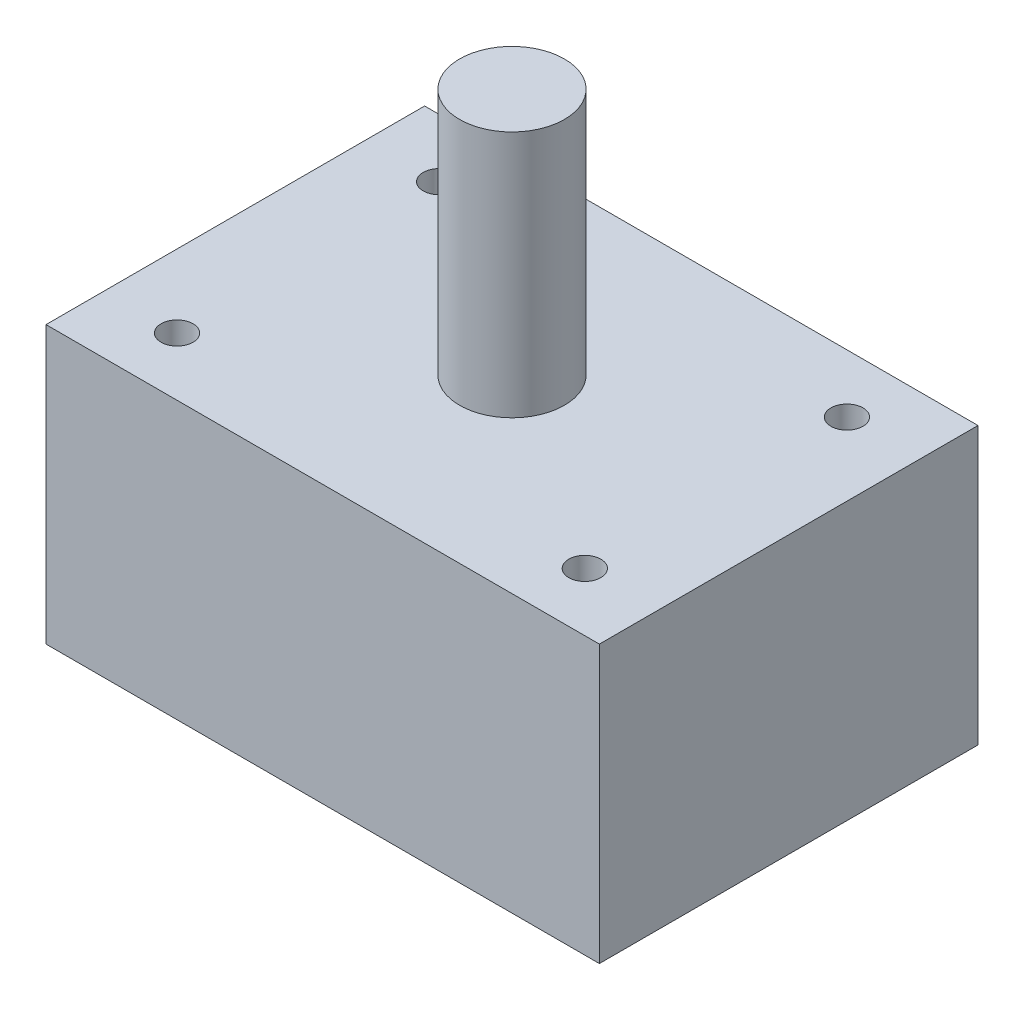
ISO-10303-21;
HEADER;
FILE_DESCRIPTION(('STEP AP214'),'2;1');
FILE_NAME('part.step','',(''),(''),'','','');
FILE_SCHEMA(('AUTOMOTIVE_DESIGN { 1 0 10303 214 1 1 1 1 }'));
ENDSEC;
DATA;
#1=APPLICATION_CONTEXT('core data for automotive mechanical design processes');
#2=APPLICATION_PROTOCOL_DEFINITION('international standard','automotive_design',2000,#1);
#3=PRODUCT_CONTEXT('',#1,'mechanical');
#4=PRODUCT('Part','Part','',(#3));
#5=PRODUCT_RELATED_PRODUCT_CATEGORY('part','',(#4));
#6=PRODUCT_DEFINITION_FORMATION('','',#4);
#7=PRODUCT_DEFINITION_CONTEXT('part definition',#1,'design');
#8=PRODUCT_DEFINITION('design','',#6,#7);
#9=PRODUCT_DEFINITION_SHAPE('','',#8);
#10=(LENGTH_UNIT() NAMED_UNIT(*) SI_UNIT(.MILLI.,.METRE.));
#11=(NAMED_UNIT(*) PLANE_ANGLE_UNIT() SI_UNIT($,.RADIAN.));
#12=(NAMED_UNIT(*) SI_UNIT($,.STERADIAN.) SOLID_ANGLE_UNIT());
#13=UNCERTAINTY_MEASURE_WITH_UNIT(LENGTH_MEASURE(1.E-05),#10,'distance_accuracy_value','');
#14=(GEOMETRIC_REPRESENTATION_CONTEXT(3) GLOBAL_UNCERTAINTY_ASSIGNED_CONTEXT((#13)) GLOBAL_UNIT_ASSIGNED_CONTEXT((#10,
#11,#12)) REPRESENTATION_CONTEXT('',''));
#15=CARTESIAN_POINT('',(0.,0.,0.));
#16=DIRECTION('',(0.,0.,1.));
#17=DIRECTION('',(1.,0.,0.));
#18=AXIS2_PLACEMENT_3D('',#15,#16,#17);
#19=CARTESIAN_POINT('',(0.,95.,0.));
#20=DIRECTION('',(0.,-1.,0.));
#21=DIRECTION('',(0.,0.,-1.));
#22=AXIS2_PLACEMENT_3D('',#19,#20,#21);
#23=PLANE('',#22);
#24=CARTESIAN_POINT('',(0.,95.,0.));
#25=DIRECTION('',(0.,-1.,0.));
#26=DIRECTION('',(0.,0.,-1.));
#27=AXIS2_PLACEMENT_3D('',#24,#25,#26);
#28=CIRCLE('',#27,18.);
#29=CARTESIAN_POINT('',(0.,95.,-18.));
#30=VERTEX_POINT('',#29);
#31=EDGE_CURVE('E11',#30,#30,#28,.F.);
#32=ORIENTED_EDGE('',*,*,#31,.F.);
#33=EDGE_LOOP('',(#32));
#34=FACE_BOUND('',#33,.T.);
#35=DIRECTION('',(0.,0.,-1.));
#36=VECTOR('',#35,1.);
#37=CARTESIAN_POINT('',(95.,95.,65.));
#38=LINE('',#37,#36);
#39=CARTESIAN_POINT('',(95.,95.,65.));
#40=VERTEX_POINT('',#39);
#41=CARTESIAN_POINT('',(95.,95.,-65.));
#42=VERTEX_POINT('',#41);
#43=EDGE_CURVE('E93',#40,#42,#38,.T.);
#44=ORIENTED_EDGE('',*,*,#43,.T.);
#45=DIRECTION('',(-1.,0.,0.));
#46=VECTOR('',#45,1.);
#47=CARTESIAN_POINT('',(-95.,95.,-65.));
#48=LINE('',#47,#46);
#49=CARTESIAN_POINT('',(-95.,95.,-65.));
#50=VERTEX_POINT('',#49);
#51=EDGE_CURVE('E88',#42,#50,#48,.T.);
#52=ORIENTED_EDGE('',*,*,#51,.T.);
#53=DIRECTION('',(0.,0.,1.));
#54=VECTOR('',#53,1.);
#55=CARTESIAN_POINT('',(-95.,95.,65.));
#56=LINE('',#55,#54);
#57=CARTESIAN_POINT('',(-95.,95.,65.));
#58=VERTEX_POINT('',#57);
#59=EDGE_CURVE('E91',#50,#58,#56,.T.);
#60=ORIENTED_EDGE('',*,*,#59,.T.);
#61=DIRECTION('',(1.,0.,0.));
#62=VECTOR('',#61,1.);
#63=CARTESIAN_POINT('',(-95.,95.,65.));
#64=LINE('',#63,#62);
#65=EDGE_CURVE('E57',#58,#40,#64,.T.);
#66=ORIENTED_EDGE('',*,*,#65,.T.);
#67=EDGE_LOOP('',(#44,#52,#60,#66));
#68=FACE_BOUND('',#67,.T.);
#69=CARTESIAN_POINT('',(-70.,95.,45.));
#70=DIRECTION('',(0.,1.,0.));
#71=DIRECTION('',(0.,0.,1.));
#72=AXIS2_PLACEMENT_3D('',#69,#70,#71);
#73=CIRCLE('',#72,5.5);
#74=CARTESIAN_POINT('',(-70.,95.,50.5));
#75=VERTEX_POINT('',#74);
#76=EDGE_CURVE('E109',#75,#75,#73,.T.);
#77=ORIENTED_EDGE('',*,*,#76,.F.);
#78=EDGE_LOOP('',(#77));
#79=FACE_BOUND('',#78,.T.);
#80=CARTESIAN_POINT('',(70.,95.,45.));
#81=DIRECTION('',(0.,1.,0.));
#82=DIRECTION('',(0.,0.,1.));
#83=AXIS2_PLACEMENT_3D('',#80,#81,#82);
#84=CIRCLE('',#83,5.5);
#85=CARTESIAN_POINT('',(70.,95.,50.5));
#86=VERTEX_POINT('',#85);
#87=EDGE_CURVE('E124',#86,#86,#84,.T.);
#88=ORIENTED_EDGE('',*,*,#87,.F.);
#89=EDGE_LOOP('',(#88));
#90=FACE_BOUND('',#89,.T.);
#91=CARTESIAN_POINT('',(-70.,95.,-45.));
#92=DIRECTION('',(0.,1.,0.));
#93=DIRECTION('',(0.,0.,1.));
#94=AXIS2_PLACEMENT_3D('',#91,#92,#93);
#95=CIRCLE('',#94,5.5);
#96=CARTESIAN_POINT('',(-70.,95.,-39.5));
#97=VERTEX_POINT('',#96);
#98=EDGE_CURVE('E130',#97,#97,#95,.T.);
#99=ORIENTED_EDGE('',*,*,#98,.F.);
#100=EDGE_LOOP('',(#99));
#101=FACE_BOUND('',#100,.T.);
#102=CARTESIAN_POINT('',(70.,95.,-45.));
#103=DIRECTION('',(0.,1.,0.));
#104=DIRECTION('',(0.,0.,1.));
#105=AXIS2_PLACEMENT_3D('',#102,#103,#104);
#106=CIRCLE('',#105,5.5);
#107=CARTESIAN_POINT('',(70.,95.,-39.5));
#108=VERTEX_POINT('',#107);
#109=EDGE_CURVE('E136',#108,#108,#106,.T.);
#110=ORIENTED_EDGE('',*,*,#109,.F.);
#111=EDGE_LOOP('',(#110));
#112=FACE_BOUND('',#111,.T.);
#113=ADVANCED_FACE('F39',(#34,#68,#79,#90,#101,#112),#23,.F.);
#114=CARTESIAN_POINT('',(0.,0.,0.));
#115=DIRECTION('',(0.,-1.,0.));
#116=DIRECTION('',(0.,0.,-1.));
#117=AXIS2_PLACEMENT_3D('',#114,#115,#116);
#118=PLANE('',#117);
#119=CARTESIAN_POINT('',(-70.,0.,-45.));
#120=DIRECTION('',(0.,1.,0.));
#121=DIRECTION('',(0.,0.,1.));
#122=AXIS2_PLACEMENT_3D('',#119,#120,#121);
#123=CIRCLE('',#122,5.5);
#124=CARTESIAN_POINT('',(-70.,0.,-39.5));
#125=VERTEX_POINT('',#124);
#126=EDGE_CURVE('E133',#125,#125,#123,.T.);
#127=ORIENTED_EDGE('',*,*,#126,.T.);
#128=EDGE_LOOP('',(#127));
#129=FACE_BOUND('',#128,.T.);
#130=CARTESIAN_POINT('',(-70.,0.,45.));
#131=DIRECTION('',(0.,1.,0.));
#132=DIRECTION('',(0.,0.,1.));
#133=AXIS2_PLACEMENT_3D('',#130,#131,#132);
#134=CIRCLE('',#133,5.5);
#135=CARTESIAN_POINT('',(-70.,0.,50.5));
#136=VERTEX_POINT('',#135);
#137=EDGE_CURVE('E121',#136,#136,#134,.T.);
#138=ORIENTED_EDGE('',*,*,#137,.T.);
#139=EDGE_LOOP('',(#138));
#140=FACE_BOUND('',#139,.T.);
#141=DIRECTION('',(0.,0.,-1.));
#142=VECTOR('',#141,1.);
#143=CARTESIAN_POINT('',(95.,0.,65.));
#144=LINE('',#143,#142);
#145=CARTESIAN_POINT('',(95.,0.,65.));
#146=VERTEX_POINT('',#145);
#147=CARTESIAN_POINT('',(95.,0.,-65.));
#148=VERTEX_POINT('',#147);
#149=EDGE_CURVE('E106',#146,#148,#144,.T.);
#150=ORIENTED_EDGE('',*,*,#149,.F.);
#151=DIRECTION('',(1.,0.,0.));
#152=VECTOR('',#151,1.);
#153=CARTESIAN_POINT('',(-95.,0.,65.));
#154=LINE('',#153,#152);
#155=CARTESIAN_POINT('',(-95.,0.,65.));
#156=VERTEX_POINT('',#155);
#157=EDGE_CURVE('E80',#156,#146,#154,.T.);
#158=ORIENTED_EDGE('',*,*,#157,.F.);
#159=DIRECTION('',(0.,0.,1.));
#160=VECTOR('',#159,1.);
#161=CARTESIAN_POINT('',(-95.,0.,65.));
#162=LINE('',#161,#160);
#163=CARTESIAN_POINT('',(-95.,0.,-65.));
#164=VERTEX_POINT('',#163);
#165=EDGE_CURVE('E74',#164,#156,#162,.T.);
#166=ORIENTED_EDGE('',*,*,#165,.F.);
#167=DIRECTION('',(-1.,0.,0.));
#168=VECTOR('',#167,1.);
#169=CARTESIAN_POINT('',(-95.,0.,-65.));
#170=LINE('',#169,#168);
#171=EDGE_CURVE('E98',#148,#164,#170,.T.);
#172=ORIENTED_EDGE('',*,*,#171,.F.);
#173=EDGE_LOOP('',(#150,#158,#166,#172));
#174=FACE_BOUND('',#173,.T.);
#175=CARTESIAN_POINT('',(70.,0.,45.));
#176=DIRECTION('',(0.,1.,0.));
#177=DIRECTION('',(0.,0.,1.));
#178=AXIS2_PLACEMENT_3D('',#175,#176,#177);
#179=CIRCLE('',#178,5.5);
#180=CARTESIAN_POINT('',(70.,0.,50.5));
#181=VERTEX_POINT('',#180);
#182=EDGE_CURVE('E127',#181,#181,#179,.T.);
#183=ORIENTED_EDGE('',*,*,#182,.T.);
#184=EDGE_LOOP('',(#183));
#185=FACE_BOUND('',#184,.T.);
#186=CARTESIAN_POINT('',(70.,0.,-45.));
#187=DIRECTION('',(0.,1.,0.));
#188=DIRECTION('',(0.,0.,1.));
#189=AXIS2_PLACEMENT_3D('',#186,#187,#188);
#190=CIRCLE('',#189,5.5);
#191=CARTESIAN_POINT('',(70.,0.,-39.5));
#192=VERTEX_POINT('',#191);
#193=EDGE_CURVE('E139',#192,#192,#190,.T.);
#194=ORIENTED_EDGE('',*,*,#193,.T.);
#195=EDGE_LOOP('',(#194));
#196=FACE_BOUND('',#195,.T.);
#197=ADVANCED_FACE('F117',(#129,#140,#174,#185,#196),#118,.T.);
#198=CARTESIAN_POINT('',(95.,95.,65.));
#199=DIRECTION('',(-1.,0.,0.));
#200=DIRECTION('',(0.,0.,1.));
#201=AXIS2_PLACEMENT_3D('',#198,#199,#200);
#202=PLANE('',#201);
#203=ORIENTED_EDGE('',*,*,#149,.T.);
#204=DIRECTION('',(0.,-1.,0.));
#205=VECTOR('',#204,1.);
#206=CARTESIAN_POINT('',(95.,95.,-65.));
#207=LINE('',#206,#205);
#208=EDGE_CURVE('E43',#42,#148,#207,.T.);
#209=ORIENTED_EDGE('',*,*,#208,.F.);
#210=ORIENTED_EDGE('',*,*,#43,.F.);
#211=DIRECTION('',(0.,-1.,0.));
#212=VECTOR('',#211,1.);
#213=CARTESIAN_POINT('',(95.,95.,65.));
#214=LINE('',#213,#212);
#215=EDGE_CURVE('E102',#40,#146,#214,.T.);
#216=ORIENTED_EDGE('',*,*,#215,.T.);
#217=EDGE_LOOP('',(#203,#209,#210,#216));
#218=FACE_BOUND('',#217,.T.);
#219=ADVANCED_FACE('F41',(#218),#202,.F.);
#220=CARTESIAN_POINT('',(-95.,95.,-65.));
#221=DIRECTION('',(0.,0.,1.));
#222=DIRECTION('',(1.,0.,0.));
#223=AXIS2_PLACEMENT_3D('',#220,#221,#222);
#224=PLANE('',#223);
#225=ORIENTED_EDGE('',*,*,#171,.T.);
#226=DIRECTION('',(0.,-1.,0.));
#227=VECTOR('',#226,1.);
#228=CARTESIAN_POINT('',(-95.,95.,-65.));
#229=LINE('',#228,#227);
#230=EDGE_CURVE('E96',#50,#164,#229,.T.);
#231=ORIENTED_EDGE('',*,*,#230,.F.);
#232=ORIENTED_EDGE('',*,*,#51,.F.);
#233=ORIENTED_EDGE('',*,*,#208,.T.);
#234=EDGE_LOOP('',(#225,#231,#232,#233));
#235=FACE_BOUND('',#234,.T.);
#236=ADVANCED_FACE('F97',(#235),#224,.F.);
#237=CARTESIAN_POINT('',(-95.,95.,65.));
#238=DIRECTION('',(1.,0.,0.));
#239=DIRECTION('',(0.,0.,-1.));
#240=AXIS2_PLACEMENT_3D('',#237,#238,#239);
#241=PLANE('',#240);
#242=ORIENTED_EDGE('',*,*,#165,.T.);
#243=DIRECTION('',(0.,-1.,0.));
#244=VECTOR('',#243,1.);
#245=CARTESIAN_POINT('',(-95.,95.,65.));
#246=LINE('',#245,#244);
#247=EDGE_CURVE('E99',#58,#156,#246,.T.);
#248=ORIENTED_EDGE('',*,*,#247,.F.);
#249=ORIENTED_EDGE('',*,*,#59,.F.);
#250=ORIENTED_EDGE('',*,*,#230,.T.);
#251=EDGE_LOOP('',(#242,#248,#249,#250));
#252=FACE_BOUND('',#251,.T.);
#253=ADVANCED_FACE('F100',(#252),#241,.F.);
#254=CARTESIAN_POINT('',(-95.,95.,65.));
#255=DIRECTION('',(0.,0.,-1.));
#256=DIRECTION('',(-1.,0.,0.));
#257=AXIS2_PLACEMENT_3D('',#254,#255,#256);
#258=PLANE('',#257);
#259=ORIENTED_EDGE('',*,*,#157,.T.);
#260=ORIENTED_EDGE('',*,*,#215,.F.);
#261=ORIENTED_EDGE('',*,*,#65,.F.);
#262=ORIENTED_EDGE('',*,*,#247,.T.);
#263=EDGE_LOOP('',(#259,#260,#261,#262));
#264=FACE_BOUND('',#263,.T.);
#265=ADVANCED_FACE('F114',(#264),#258,.F.);
#266=CARTESIAN_POINT('',(-70.,95.,45.));
#267=DIRECTION('',(0.,-1.,0.));
#268=DIRECTION('',(0.,0.,-1.));
#269=AXIS2_PLACEMENT_3D('',#266,#267,#268);
#270=CYLINDRICAL_SURFACE('',#269,5.5);
#271=ORIENTED_EDGE('',*,*,#76,.T.);
#272=EDGE_LOOP('',(#271));
#273=FACE_BOUND('',#272,.T.);
#274=ORIENTED_EDGE('',*,*,#137,.F.);
#275=EDGE_LOOP('',(#274));
#276=FACE_BOUND('',#275,.T.);
#277=ADVANCED_FACE('F165',(#273,#276),#270,.F.);
#278=CARTESIAN_POINT('',(70.,95.,45.));
#279=DIRECTION('',(0.,-1.,0.));
#280=DIRECTION('',(0.,0.,-1.));
#281=AXIS2_PLACEMENT_3D('',#278,#279,#280);
#282=CYLINDRICAL_SURFACE('',#281,5.5);
#283=ORIENTED_EDGE('',*,*,#87,.T.);
#284=EDGE_LOOP('',(#283));
#285=FACE_BOUND('',#284,.T.);
#286=ORIENTED_EDGE('',*,*,#182,.F.);
#287=EDGE_LOOP('',(#286));
#288=FACE_BOUND('',#287,.T.);
#289=ADVANCED_FACE('F221',(#285,#288),#282,.F.);
#290=CARTESIAN_POINT('',(-70.,95.,-45.));
#291=DIRECTION('',(0.,-1.,0.));
#292=DIRECTION('',(0.,0.,-1.));
#293=AXIS2_PLACEMENT_3D('',#290,#291,#292);
#294=CYLINDRICAL_SURFACE('',#293,5.5);
#295=ORIENTED_EDGE('',*,*,#98,.T.);
#296=EDGE_LOOP('',(#295));
#297=FACE_BOUND('',#296,.T.);
#298=ORIENTED_EDGE('',*,*,#126,.F.);
#299=EDGE_LOOP('',(#298));
#300=FACE_BOUND('',#299,.T.);
#301=ADVANCED_FACE('F212',(#297,#300),#294,.F.);
#302=CARTESIAN_POINT('',(70.,95.,-45.));
#303=DIRECTION('',(0.,-1.,0.));
#304=DIRECTION('',(0.,0.,-1.));
#305=AXIS2_PLACEMENT_3D('',#302,#303,#304);
#306=CYLINDRICAL_SURFACE('',#305,5.5);
#307=ORIENTED_EDGE('',*,*,#109,.T.);
#308=EDGE_LOOP('',(#307));
#309=FACE_BOUND('',#308,.T.);
#310=ORIENTED_EDGE('',*,*,#193,.F.);
#311=EDGE_LOOP('',(#310));
#312=FACE_BOUND('',#311,.T.);
#313=ADVANCED_FACE('F153',(#309,#312),#306,.F.);
#314=CARTESIAN_POINT('',(0.,180.,0.));
#315=DIRECTION('',(0.,-1.,0.));
#316=DIRECTION('',(0.,0.,-1.));
#317=AXIS2_PLACEMENT_3D('',#314,#315,#316);
#318=CYLINDRICAL_SURFACE('',#317,18.);
#319=CARTESIAN_POINT('',(0.,180.,0.));
#320=DIRECTION('',(0.,1.,0.));
#321=DIRECTION('',(0.,0.,1.));
#322=AXIS2_PLACEMENT_3D('',#319,#320,#321);
#323=CIRCLE('',#322,18.);
#324=CARTESIAN_POINT('',(0.,180.,-18.));
#325=VERTEX_POINT('',#324);
#326=EDGE_CURVE('E142',#325,#325,#323,.T.);
#327=CARTESIAN_POINT('',(0.,180.,-18.));
#328=CARTESIAN_POINT('',(0.,179.114583333333,-18.));
#329=CARTESIAN_POINT('',(0.,178.229166666667,-18.));
#330=CARTESIAN_POINT('',(0.,176.458333333333,-18.));
#331=CARTESIAN_POINT('',(0.,175.572916666667,-18.));
#332=CARTESIAN_POINT('',(0.,173.802083333333,-18.));
#333=CARTESIAN_POINT('',(0.,172.916666666667,-18.));
#334=CARTESIAN_POINT('',(0.,171.145833333333,-18.));
#335=CARTESIAN_POINT('',(0.,170.260416666667,-18.));
#336=CARTESIAN_POINT('',(0.,168.489583333333,-18.));
#337=CARTESIAN_POINT('',(0.,167.604166666667,-18.));
#338=CARTESIAN_POINT('',(0.,165.833333333333,-18.));
#339=CARTESIAN_POINT('',(0.,164.947916666667,-18.));
#340=CARTESIAN_POINT('',(0.,163.177083333333,-18.));
#341=CARTESIAN_POINT('',(0.,162.291666666667,-18.));
#342=CARTESIAN_POINT('',(0.,160.520833333333,-18.));
#343=CARTESIAN_POINT('',(0.,159.635416666667,-18.));
#344=CARTESIAN_POINT('',(0.,157.864583333333,-18.));
#345=CARTESIAN_POINT('',(0.,156.979166666667,-18.));
#346=CARTESIAN_POINT('',(0.,155.208333333333,-18.));
#347=CARTESIAN_POINT('',(0.,154.322916666667,-18.));
#348=CARTESIAN_POINT('',(0.,152.552083333333,-18.));
#349=CARTESIAN_POINT('',(0.,151.666666666667,-18.));
#350=CARTESIAN_POINT('',(0.,149.895833333333,-18.));
#351=CARTESIAN_POINT('',(0.,149.010416666667,-18.));
#352=CARTESIAN_POINT('',(0.,147.239583333333,-18.));
#353=CARTESIAN_POINT('',(0.,146.354166666667,-18.));
#354=CARTESIAN_POINT('',(0.,144.583333333333,-18.));
#355=CARTESIAN_POINT('',(0.,143.697916666667,-18.));
#356=CARTESIAN_POINT('',(0.,141.927083333333,-18.));
#357=CARTESIAN_POINT('',(0.,141.041666666667,-18.));
#358=CARTESIAN_POINT('',(0.,139.270833333333,-18.));
#359=CARTESIAN_POINT('',(0.,138.385416666667,-18.));
#360=CARTESIAN_POINT('',(0.,136.614583333333,-18.));
#361=CARTESIAN_POINT('',(0.,135.729166666667,-18.));
#362=CARTESIAN_POINT('',(0.,133.958333333333,-18.));
#363=CARTESIAN_POINT('',(0.,133.072916666667,-18.));
#364=CARTESIAN_POINT('',(0.,131.302083333333,-18.));
#365=CARTESIAN_POINT('',(0.,130.416666666667,-18.));
#366=CARTESIAN_POINT('',(0.,128.645833333333,-18.));
#367=CARTESIAN_POINT('',(0.,127.760416666667,-18.));
#368=CARTESIAN_POINT('',(0.,125.989583333333,-18.));
#369=CARTESIAN_POINT('',(0.,125.104166666667,-18.));
#370=CARTESIAN_POINT('',(0.,123.333333333333,-18.));
#371=CARTESIAN_POINT('',(0.,122.447916666667,-18.));
#372=CARTESIAN_POINT('',(0.,120.677083333333,-18.));
#373=CARTESIAN_POINT('',(0.,119.791666666667,-18.));
#374=CARTESIAN_POINT('',(0.,118.020833333333,-18.));
#375=CARTESIAN_POINT('',(0.,117.135416666667,-18.));
#376=CARTESIAN_POINT('',(0.,115.364583333333,-18.));
#377=CARTESIAN_POINT('',(0.,114.479166666667,-18.));
#378=CARTESIAN_POINT('',(0.,112.708333333333,-18.));
#379=CARTESIAN_POINT('',(0.,111.822916666667,-18.));
#380=CARTESIAN_POINT('',(0.,110.052083333333,-18.));
#381=CARTESIAN_POINT('',(0.,109.166666666667,-18.));
#382=CARTESIAN_POINT('',(0.,107.395833333333,-18.));
#383=CARTESIAN_POINT('',(0.,106.510416666667,-18.));
#384=CARTESIAN_POINT('',(0.,104.739583333333,-18.));
#385=CARTESIAN_POINT('',(0.,103.854166666667,-18.));
#386=CARTESIAN_POINT('',(0.,102.083333333333,-18.));
#387=CARTESIAN_POINT('',(0.,101.197916666667,-18.));
#388=CARTESIAN_POINT('',(0.,99.4270833333333,-18.));
#389=CARTESIAN_POINT('',(0.,98.5416666666667,-18.));
#390=CARTESIAN_POINT('',(0.,96.7708333333333,-18.));
#391=CARTESIAN_POINT('',(0.,95.8854166666667,-18.));
#392=CARTESIAN_POINT('',(0.,95.,-18.));
#393=B_SPLINE_CURVE_WITH_KNOTS('',3,(#327,#328,#329,#330,#331,#332,#333,#334,#335,#336,#337,
#338,#339,#340,#341,#342,#343,#344,#345,#346,#347,#348,#349,#350,#351,#352,#353,#354,#355,#356,
#357,#358,#359,#360,#361,#362,#363,#364,#365,#366,#367,#368,#369,#370,#371,#372,#373,#374,#375,
#376,#377,#378,#379,#380,#381,#382,#383,#384,#385,#386,#387,#388,#389,#390,#391,#392),
.UNSPECIFIED.,.F.,.F.,(4,2,2,2,2,2,2,2,2,2,2,2,2,2,2,2,2,2,2,2,2,2,2,2,2,2,2,2,2,2,2,2,4),(0.,
2.65625000000003,5.3125,7.96875000000002,10.625,13.28125,15.9375,18.59375,21.25,23.90625,
26.5625,29.21875,31.875,34.53125,37.1875,39.84375,42.5,45.15625,47.8125,50.46875,53.125,
55.78125,58.4375,61.09375,63.75,66.40625,69.0625,71.71875,74.375,77.03125,79.6875,82.34375,85.),.UNSPECIFIED.);
#394=EDGE_CURVE('BSEAM150',#325,#30,#393,.T.);
#395=ORIENTED_EDGE('',*,*,#326,.F.);
#396=ORIENTED_EDGE('',*,*,#31,.T.);
#397=ORIENTED_EDGE('',*,*,#394,.T.);
#398=ORIENTED_EDGE('',*,*,#394,.F.);
#399=EDGE_LOOP('',(#395,#397,#396,#398));
#400=FACE_BOUND('',#399,.T.);
#401=ADVANCED_FACE('F150',(#400),#318,.T.);
#402=CARTESIAN_POINT('',(0.,180.,0.));
#403=DIRECTION('',(0.,1.,0.));
#404=DIRECTION('',(0.,0.,1.));
#405=AXIS2_PLACEMENT_3D('',#402,#403,#404);
#406=PLANE('',#405);
#407=ORIENTED_EDGE('',*,*,#326,.T.);
#408=EDGE_LOOP('',(#407));
#409=FACE_BOUND('',#408,.T.);
#410=ADVANCED_FACE('F148',(#409),#406,.T.);
#411=CLOSED_SHELL('',(#113,#197,#219,#236,#253,#265,#277,#289,#301,#313,#401,#410));
#412=MANIFOLD_SOLID_BREP('B2',#411);
#413=ADVANCED_BREP_SHAPE_REPRESENTATION('',(#18,#412),#14);
#414=SHAPE_DEFINITION_REPRESENTATION(#9,#413);
ENDSEC;
END-ISO-10303-21;
